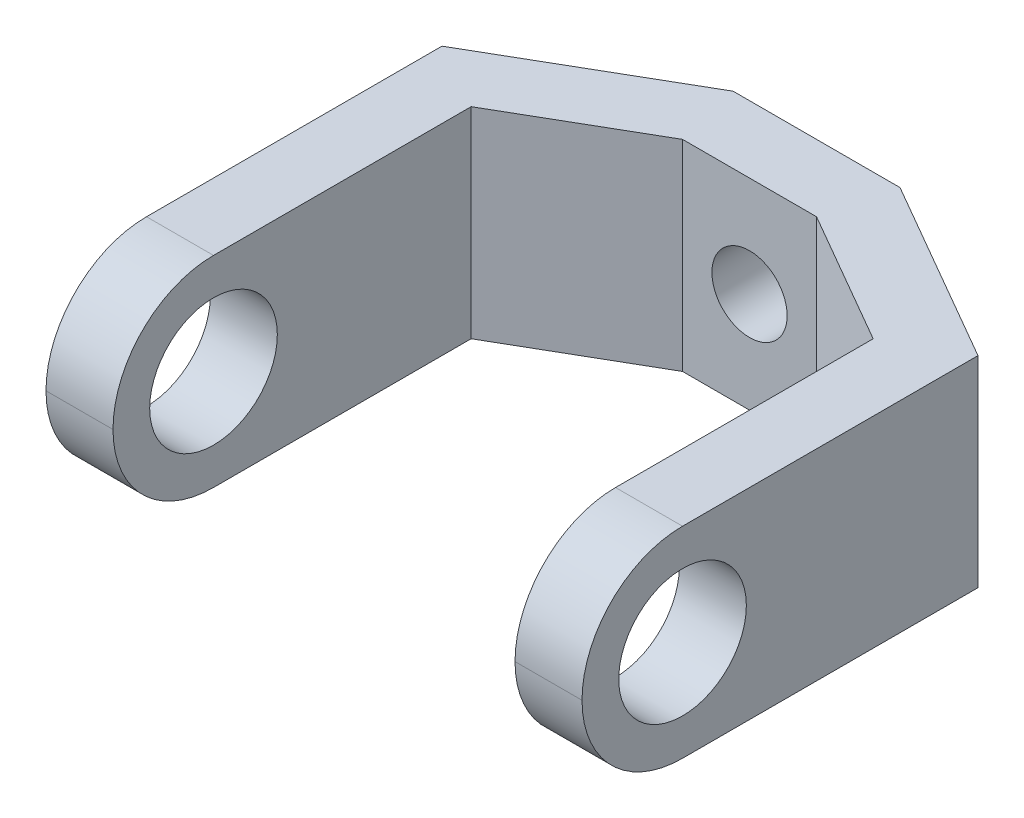
ISO-10303-21;
HEADER;
FILE_DESCRIPTION(('STEP AP214'),'2;1');
FILE_NAME('part.step','',(''),(''),'','','');
FILE_SCHEMA(('AUTOMOTIVE_DESIGN { 1 0 10303 214 1 1 1 1 }'));
ENDSEC;
DATA;
#1=APPLICATION_CONTEXT('core data for automotive mechanical design processes');
#2=APPLICATION_PROTOCOL_DEFINITION('international standard','automotive_design',2000,#1);
#3=PRODUCT_CONTEXT('',#1,'mechanical');
#4=PRODUCT('Part','Part','',(#3));
#5=PRODUCT_RELATED_PRODUCT_CATEGORY('part','',(#4));
#6=PRODUCT_DEFINITION_FORMATION('','',#4);
#7=PRODUCT_DEFINITION_CONTEXT('part definition',#1,'design');
#8=PRODUCT_DEFINITION('design','',#6,#7);
#9=PRODUCT_DEFINITION_SHAPE('','',#8);
#10=(LENGTH_UNIT() NAMED_UNIT(*) SI_UNIT(.MILLI.,.METRE.));
#11=(NAMED_UNIT(*) PLANE_ANGLE_UNIT() SI_UNIT($,.RADIAN.));
#12=(NAMED_UNIT(*) SI_UNIT($,.STERADIAN.) SOLID_ANGLE_UNIT());
#13=UNCERTAINTY_MEASURE_WITH_UNIT(LENGTH_MEASURE(1.E-05),#10,'distance_accuracy_value','');
#14=(GEOMETRIC_REPRESENTATION_CONTEXT(3) GLOBAL_UNCERTAINTY_ASSIGNED_CONTEXT((#13)) GLOBAL_UNIT_ASSIGNED_CONTEXT((#10,
#11,#12)) REPRESENTATION_CONTEXT('',''));
#15=CARTESIAN_POINT('',(0.,0.,0.));
#16=DIRECTION('',(0.,0.,1.));
#17=DIRECTION('',(1.,0.,0.));
#18=AXIS2_PLACEMENT_3D('',#15,#16,#17);
#19=CARTESIAN_POINT('',(-15.,7.5,-19.2264973081037));
#20=DIRECTION('',(-1.,0.,0.));
#21=DIRECTION('',(0.,0.,1.));
#22=AXIS2_PLACEMENT_3D('',#19,#20,#21);
#23=PLANE('',#22);
#24=CARTESIAN_POINT('',(-15.,0.,0.));
#25=DIRECTION('',(-1.,0.,0.));
#26=DIRECTION('',(0.,0.,1.));
#27=AXIS2_PLACEMENT_3D('',#24,#25,#26);
#28=CIRCLE('',#27,4.7625);
#29=CARTESIAN_POINT('',(-15.,0.,4.7625));
#30=VERTEX_POINT('',#29);
#31=EDGE_CURVE('E237',#30,#30,#28,.T.);
#32=ORIENTED_EDGE('',*,*,#31,.T.);
#33=EDGE_LOOP('',(#32));
#34=FACE_BOUND('',#33,.T.);
#35=CARTESIAN_POINT('',(-15.,0.,0.));
#36=DIRECTION('',(-1.,0.,0.));
#37=DIRECTION('',(0.,0.,1.));
#38=AXIS2_PLACEMENT_3D('',#35,#36,#37);
#39=CIRCLE('',#38,7.5);
#40=CARTESIAN_POINT('',(-15.,7.5,0.));
#41=VERTEX_POINT('',#40);
#42=CARTESIAN_POINT('',(-15.,0.,7.5));
#43=VERTEX_POINT('',#42);
#44=EDGE_CURVE('E63',#41,#43,#39,.F.);
#45=ORIENTED_EDGE('',*,*,#44,.T.);
#46=CARTESIAN_POINT('',(-15.,0.,0.));
#47=DIRECTION('',(-1.,0.,0.));
#48=DIRECTION('',(0.,0.,1.));
#49=AXIS2_PLACEMENT_3D('',#46,#47,#48);
#50=CIRCLE('',#49,7.5);
#51=CARTESIAN_POINT('',(-15.,-7.5,0.));
#52=VERTEX_POINT('',#51);
#53=EDGE_CURVE('E200',#43,#52,#50,.F.);
#54=ORIENTED_EDGE('',*,*,#53,.T.);
#55=DIRECTION('',(0.,0.,-1.));
#56=VECTOR('',#55,1.);
#57=CARTESIAN_POINT('',(-15.,-7.5,-19.2264973081037));
#58=LINE('',#57,#56);
#59=CARTESIAN_POINT('',(-15.,-7.5,-19.2264973081037));
#60=VERTEX_POINT('',#59);
#61=EDGE_CURVE('E164',#52,#60,#58,.T.);
#62=ORIENTED_EDGE('',*,*,#61,.T.);
#63=DIRECTION('',(0.,-1.,0.));
#64=VECTOR('',#63,1.);
#65=CARTESIAN_POINT('',(-15.,7.5,-19.2264973081037));
#66=LINE('',#65,#64);
#67=CARTESIAN_POINT('',(-15.,7.5,-19.2264973081037));
#68=VERTEX_POINT('',#67);
#69=EDGE_CURVE('E156',#68,#60,#66,.T.);
#70=ORIENTED_EDGE('',*,*,#69,.F.);
#71=DIRECTION('',(0.,0.,-1.));
#72=VECTOR('',#71,1.);
#73=CARTESIAN_POINT('',(-15.,7.5,-19.2264973081037));
#74=LINE('',#73,#72);
#75=EDGE_CURVE('E140',#41,#68,#74,.T.);
#76=ORIENTED_EDGE('',*,*,#75,.F.);
#77=EDGE_LOOP('',(#45,#54,#62,#70,#76));
#78=FACE_BOUND('',#77,.T.);
#79=ADVANCED_FACE('F39',(#34,#78),#23,.F.);
#80=CARTESIAN_POINT('',(-4.99999999999997,7.5,-25.));
#81=DIRECTION('',(-0.500000000000001,0.,-0.866025403784438));
#82=DIRECTION('',(-0.866025403784438,0.,0.500000000000001));
#83=AXIS2_PLACEMENT_3D('',#80,#81,#82);
#84=PLANE('',#83);
#85=DIRECTION('',(0.866025403784438,0.,-0.500000000000001));
#86=VECTOR('',#85,1.);
#87=CARTESIAN_POINT('',(-4.99999999999997,-7.5,-25.));
#88=LINE('',#87,#86);
#89=CARTESIAN_POINT('',(-4.99999999999997,-7.5,-25.));
#90=VERTEX_POINT('',#89);
#91=EDGE_CURVE('E267',#60,#90,#88,.T.);
#92=ORIENTED_EDGE('',*,*,#91,.T.);
#93=DIRECTION('',(0.,-1.,0.));
#94=VECTOR('',#93,1.);
#95=CARTESIAN_POINT('',(-4.99999999999997,7.5,-25.));
#96=LINE('',#95,#94);
#97=CARTESIAN_POINT('',(-4.99999999999997,7.5,-25.));
#98=VERTEX_POINT('',#97);
#99=EDGE_CURVE('E158',#98,#90,#96,.T.);
#100=ORIENTED_EDGE('',*,*,#99,.F.);
#101=DIRECTION('',(0.866025403784438,0.,-0.500000000000001));
#102=VECTOR('',#101,1.);
#103=CARTESIAN_POINT('',(-4.99999999999997,7.5,-25.));
#104=LINE('',#103,#102);
#105=EDGE_CURVE('E144',#68,#98,#104,.T.);
#106=ORIENTED_EDGE('',*,*,#105,.F.);
#107=ORIENTED_EDGE('',*,*,#69,.T.);
#108=EDGE_LOOP('',(#92,#100,#106,#107));
#109=FACE_BOUND('',#108,.T.);
#110=ADVANCED_FACE('F155',(#109),#84,.F.);
#111=CARTESIAN_POINT('',(5.00000000000003,7.5,-25.));
#112=DIRECTION('',(0.,0.,-1.));
#113=DIRECTION('',(-1.,0.,0.));
#114=AXIS2_PLACEMENT_3D('',#111,#112,#113);
#115=PLANE('',#114);
#116=CARTESIAN_POINT('',(0.,0.,-25.));
#117=DIRECTION('',(0.,0.,-1.));
#118=DIRECTION('',(-1.,0.,0.));
#119=AXIS2_PLACEMENT_3D('',#116,#117,#118);
#120=CIRCLE('',#119,2.8067);
#121=CARTESIAN_POINT('',(-2.8067,0.,-25.));
#122=VERTEX_POINT('',#121);
#123=EDGE_CURVE('E217',#122,#122,#120,.T.);
#124=ORIENTED_EDGE('',*,*,#123,.T.);
#125=EDGE_LOOP('',(#124));
#126=FACE_BOUND('',#125,.T.);
#127=DIRECTION('',(1.,0.,0.));
#128=VECTOR('',#127,1.);
#129=CARTESIAN_POINT('',(5.00000000000003,-7.5,-25.));
#130=LINE('',#129,#128);
#131=CARTESIAN_POINT('',(5.00000000000003,-7.5,-25.));
#132=VERTEX_POINT('',#131);
#133=EDGE_CURVE('E270',#90,#132,#130,.T.);
#134=ORIENTED_EDGE('',*,*,#133,.T.);
#135=DIRECTION('',(0.,-1.,0.));
#136=VECTOR('',#135,1.);
#137=CARTESIAN_POINT('',(5.00000000000003,7.5,-25.));
#138=LINE('',#137,#136);
#139=CARTESIAN_POINT('',(5.00000000000003,7.5,-25.));
#140=VERTEX_POINT('',#139);
#141=EDGE_CURVE('E172',#140,#132,#138,.T.);
#142=ORIENTED_EDGE('',*,*,#141,.F.);
#143=DIRECTION('',(1.,0.,0.));
#144=VECTOR('',#143,1.);
#145=CARTESIAN_POINT('',(5.00000000000003,7.5,-25.));
#146=LINE('',#145,#144);
#147=EDGE_CURVE('E161',#98,#140,#146,.T.);
#148=ORIENTED_EDGE('',*,*,#147,.F.);
#149=ORIENTED_EDGE('',*,*,#99,.T.);
#150=EDGE_LOOP('',(#134,#142,#148,#149));
#151=FACE_BOUND('',#150,.T.);
#152=ADVANCED_FACE('F337',(#126,#151),#115,.F.);
#153=CARTESIAN_POINT('',(15.,7.5,-19.2264973081037));
#154=DIRECTION('',(0.5,0.,-0.866025403784438));
#155=DIRECTION('',(-0.866025403784439,0.,-0.5));
#156=AXIS2_PLACEMENT_3D('',#153,#154,#155);
#157=PLANE('',#156);
#158=DIRECTION('',(0.866025403784438,0.,0.5));
#159=VECTOR('',#158,1.);
#160=CARTESIAN_POINT('',(15.,-7.5,-19.2264973081037));
#161=LINE('',#160,#159);
#162=CARTESIAN_POINT('',(15.,-7.5,-19.2264973081037));
#163=VERTEX_POINT('',#162);
#164=EDGE_CURVE('E273',#132,#163,#161,.T.);
#165=ORIENTED_EDGE('',*,*,#164,.T.);
#166=DIRECTION('',(0.,-1.,0.));
#167=VECTOR('',#166,1.);
#168=CARTESIAN_POINT('',(15.,7.5,-19.2264973081037));
#169=LINE('',#168,#167);
#170=CARTESIAN_POINT('',(15.,7.5,-19.2264973081037));
#171=VERTEX_POINT('',#170);
#172=EDGE_CURVE('E309',#171,#163,#169,.T.);
#173=ORIENTED_EDGE('',*,*,#172,.F.);
#174=DIRECTION('',(0.866025403784438,0.,0.5));
#175=VECTOR('',#174,1.);
#176=CARTESIAN_POINT('',(15.,7.5,-19.2264973081037));
#177=LINE('',#176,#175);
#178=EDGE_CURVE('E243',#140,#171,#177,.T.);
#179=ORIENTED_EDGE('',*,*,#178,.F.);
#180=ORIENTED_EDGE('',*,*,#141,.T.);
#181=EDGE_LOOP('',(#165,#173,#179,#180));
#182=FACE_BOUND('',#181,.T.);
#183=ADVANCED_FACE('F318',(#182),#157,.F.);
#184=CARTESIAN_POINT('',(15.,7.5,7.50000000000001));
#185=DIRECTION('',(1.,0.,0.));
#186=DIRECTION('',(0.,0.,-1.));
#187=AXIS2_PLACEMENT_3D('',#184,#185,#186);
#188=PLANE('',#187);
#189=CARTESIAN_POINT('',(15.,0.,0.));
#190=DIRECTION('',(1.,0.,0.));
#191=DIRECTION('',(0.,0.,-1.));
#192=AXIS2_PLACEMENT_3D('',#189,#190,#191);
#193=CIRCLE('',#192,4.7625);
#194=CARTESIAN_POINT('',(15.,0.,-4.7625));
#195=VERTEX_POINT('',#194);
#196=EDGE_CURVE('E233',#195,#195,#193,.T.);
#197=ORIENTED_EDGE('',*,*,#196,.T.);
#198=EDGE_LOOP('',(#197));
#199=FACE_BOUND('',#198,.T.);
#200=CARTESIAN_POINT('',(15.,0.,0.));
#201=DIRECTION('',(1.,0.,0.));
#202=DIRECTION('',(0.,0.,-1.));
#203=AXIS2_PLACEMENT_3D('',#200,#201,#202);
#204=CIRCLE('',#203,7.5);
#205=CARTESIAN_POINT('',(15.,-7.5,0.));
#206=VERTEX_POINT('',#205);
#207=CARTESIAN_POINT('',(15.,0.,7.50000000000001));
#208=VERTEX_POINT('',#207);
#209=EDGE_CURVE('E185',#206,#208,#204,.F.);
#210=ORIENTED_EDGE('',*,*,#209,.T.);
#211=CARTESIAN_POINT('',(15.,0.,0.));
#212=DIRECTION('',(1.,0.,0.));
#213=DIRECTION('',(0.,0.,-1.));
#214=AXIS2_PLACEMENT_3D('',#211,#212,#213);
#215=CIRCLE('',#214,7.5);
#216=CARTESIAN_POINT('',(15.,7.5,0.));
#217=VERTEX_POINT('',#216);
#218=EDGE_CURVE('E188',#208,#217,#215,.F.);
#219=ORIENTED_EDGE('',*,*,#218,.T.);
#220=DIRECTION('',(0.,0.,1.));
#221=VECTOR('',#220,1.);
#222=CARTESIAN_POINT('',(15.,7.5,7.50000000000001));
#223=LINE('',#222,#221);
#224=EDGE_CURVE('E246',#171,#217,#223,.T.);
#225=ORIENTED_EDGE('',*,*,#224,.F.);
#226=ORIENTED_EDGE('',*,*,#172,.T.);
#227=DIRECTION('',(0.,0.,1.));
#228=VECTOR('',#227,1.);
#229=CARTESIAN_POINT('',(15.,-7.5,7.50000000000001));
#230=LINE('',#229,#228);
#231=EDGE_CURVE('E276',#163,#206,#230,.T.);
#232=ORIENTED_EDGE('',*,*,#231,.T.);
#233=EDGE_LOOP('',(#210,#219,#225,#226,#232));
#234=FACE_BOUND('',#233,.T.);
#235=ADVANCED_FACE('F329',(#199,#234),#188,.F.);
#236=CARTESIAN_POINT('',(20.,7.5,-22.049394584692));
#237=DIRECTION('',(-1.,0.,0.));
#238=DIRECTION('',(0.,0.,1.));
#239=AXIS2_PLACEMENT_3D('',#236,#237,#238);
#240=PLANE('',#239);
#241=CARTESIAN_POINT('',(20.,0.,0.));
#242=DIRECTION('',(1.,0.,0.));
#243=DIRECTION('',(0.,0.,-1.));
#244=AXIS2_PLACEMENT_3D('',#241,#242,#243);
#245=CIRCLE('',#244,4.7625);
#246=CARTESIAN_POINT('',(20.,0.,-4.7625));
#247=VERTEX_POINT('',#246);
#248=EDGE_CURVE('E207',#247,#247,#245,.T.);
#249=ORIENTED_EDGE('',*,*,#248,.F.);
#250=EDGE_LOOP('',(#249));
#251=FACE_BOUND('',#250,.T.);
#252=DIRECTION('',(0.,0.,-1.));
#253=VECTOR('',#252,1.);
#254=CARTESIAN_POINT('',(20.,7.5,-22.049394584692));
#255=LINE('',#254,#253);
#256=CARTESIAN_POINT('',(20.,7.5,0.));
#257=VERTEX_POINT('',#256);
#258=CARTESIAN_POINT('',(20.,7.5,-22.049394584692));
#259=VERTEX_POINT('',#258);
#260=EDGE_CURVE('E249',#257,#259,#255,.T.);
#261=ORIENTED_EDGE('',*,*,#260,.F.);
#262=CARTESIAN_POINT('',(20.,0.,0.));
#263=DIRECTION('',(-1.,0.,0.));
#264=DIRECTION('',(0.,0.,1.));
#265=AXIS2_PLACEMENT_3D('',#262,#263,#264);
#266=CIRCLE('',#265,7.5);
#267=CARTESIAN_POINT('',(20.,0.,7.50000000000001));
#268=VERTEX_POINT('',#267);
#269=EDGE_CURVE('E182',#257,#268,#266,.F.);
#270=ORIENTED_EDGE('',*,*,#269,.T.);
#271=CARTESIAN_POINT('',(20.,0.,0.));
#272=DIRECTION('',(-1.,0.,0.));
#273=DIRECTION('',(0.,0.,1.));
#274=AXIS2_PLACEMENT_3D('',#271,#272,#273);
#275=CIRCLE('',#274,7.5);
#276=CARTESIAN_POINT('',(20.,-7.5,0.));
#277=VERTEX_POINT('',#276);
#278=EDGE_CURVE('E179',#268,#277,#275,.F.);
#279=ORIENTED_EDGE('',*,*,#278,.T.);
#280=DIRECTION('',(0.,0.,-1.));
#281=VECTOR('',#280,1.);
#282=CARTESIAN_POINT('',(20.,-7.5,-22.049394584692));
#283=LINE('',#282,#281);
#284=CARTESIAN_POINT('',(20.,-7.5,-22.049394584692));
#285=VERTEX_POINT('',#284);
#286=EDGE_CURVE('E280',#277,#285,#283,.T.);
#287=ORIENTED_EDGE('',*,*,#286,.T.);
#288=DIRECTION('',(0.,-1.,0.));
#289=VECTOR('',#288,1.);
#290=CARTESIAN_POINT('',(20.,7.5,-22.049394584692));
#291=LINE('',#290,#289);
#292=EDGE_CURVE('E305',#259,#285,#291,.T.);
#293=ORIENTED_EDGE('',*,*,#292,.F.);
#294=EDGE_LOOP('',(#261,#270,#279,#287,#293));
#295=FACE_BOUND('',#294,.T.);
#296=ADVANCED_FACE('F387',(#251,#295),#240,.F.);
#297=CARTESIAN_POINT('',(6.2291474697544,7.5,-30.));
#298=DIRECTION('',(-0.500000000000001,0.,0.866025403784438));
#299=DIRECTION('',(0.866025403784438,0.,0.500000000000001));
#300=AXIS2_PLACEMENT_3D('',#297,#298,#299);
#301=PLANE('',#300);
#302=DIRECTION('',(-0.866025403784438,0.,-0.500000000000001));
#303=VECTOR('',#302,1.);
#304=CARTESIAN_POINT('',(6.2291474697544,-7.5,-30.));
#305=LINE('',#304,#303);
#306=CARTESIAN_POINT('',(6.2291474697544,-7.5,-30.));
#307=VERTEX_POINT('',#306);
#308=EDGE_CURVE('E283',#285,#307,#305,.T.);
#309=ORIENTED_EDGE('',*,*,#308,.T.);
#310=DIRECTION('',(0.,-1.,0.));
#311=VECTOR('',#310,1.);
#312=CARTESIAN_POINT('',(6.2291474697544,7.5,-30.));
#313=LINE('',#312,#311);
#314=CARTESIAN_POINT('',(6.2291474697544,7.5,-30.));
#315=VERTEX_POINT('',#314);
#316=EDGE_CURVE('E301',#315,#307,#313,.T.);
#317=ORIENTED_EDGE('',*,*,#316,.F.);
#318=DIRECTION('',(-0.866025403784438,0.,-0.500000000000001));
#319=VECTOR('',#318,1.);
#320=CARTESIAN_POINT('',(6.2291474697544,7.5,-30.));
#321=LINE('',#320,#319);
#322=EDGE_CURVE('E252',#259,#315,#321,.T.);
#323=ORIENTED_EDGE('',*,*,#322,.F.);
#324=ORIENTED_EDGE('',*,*,#292,.T.);
#325=EDGE_LOOP('',(#309,#317,#323,#324));
#326=FACE_BOUND('',#325,.T.);
#327=ADVANCED_FACE('F384',(#326),#301,.F.);
#328=CARTESIAN_POINT('',(-6.22914746975434,7.5,-30.));
#329=DIRECTION('',(0.,0.,1.));
#330=DIRECTION('',(1.,0.,0.));
#331=AXIS2_PLACEMENT_3D('',#328,#329,#330);
#332=PLANE('',#331);
#333=CARTESIAN_POINT('',(0.,0.,-30.));
#334=DIRECTION('',(0.,0.,1.));
#335=DIRECTION('',(1.,0.,0.));
#336=AXIS2_PLACEMENT_3D('',#333,#334,#335);
#337=CIRCLE('',#336,2.8067);
#338=CARTESIAN_POINT('',(2.8067,0.,-30.));
#339=VERTEX_POINT('',#338);
#340=EDGE_CURVE('E222',#339,#339,#337,.T.);
#341=ORIENTED_EDGE('',*,*,#340,.T.);
#342=EDGE_LOOP('',(#341));
#343=FACE_BOUND('',#342,.T.);
#344=DIRECTION('',(-1.,0.,0.));
#345=VECTOR('',#344,1.);
#346=CARTESIAN_POINT('',(-6.22914746975434,-7.5,-30.));
#347=LINE('',#346,#345);
#348=CARTESIAN_POINT('',(-6.22914746975434,-7.5,-30.));
#349=VERTEX_POINT('',#348);
#350=EDGE_CURVE('E286',#307,#349,#347,.T.);
#351=ORIENTED_EDGE('',*,*,#350,.T.);
#352=DIRECTION('',(0.,-1.,0.));
#353=VECTOR('',#352,1.);
#354=CARTESIAN_POINT('',(-6.22914746975434,7.5,-30.));
#355=LINE('',#354,#353);
#356=CARTESIAN_POINT('',(-6.22914746975434,7.5,-30.));
#357=VERTEX_POINT('',#356);
#358=EDGE_CURVE('E297',#357,#349,#355,.T.);
#359=ORIENTED_EDGE('',*,*,#358,.F.);
#360=DIRECTION('',(-1.,0.,0.));
#361=VECTOR('',#360,1.);
#362=CARTESIAN_POINT('',(-6.22914746975434,7.5,-30.));
#363=LINE('',#362,#361);
#364=EDGE_CURVE('E255',#315,#357,#363,.T.);
#365=ORIENTED_EDGE('',*,*,#364,.F.);
#366=ORIENTED_EDGE('',*,*,#316,.T.);
#367=EDGE_LOOP('',(#351,#359,#365,#366));
#368=FACE_BOUND('',#367,.T.);
#369=ADVANCED_FACE('F379',(#343,#368),#332,.F.);
#370=CARTESIAN_POINT('',(-20.,7.5,-22.049394584692));
#371=DIRECTION('',(0.500000000000001,0.,0.866025403784438));
#372=DIRECTION('',(0.866025403784438,0.,-0.500000000000001));
#373=AXIS2_PLACEMENT_3D('',#370,#371,#372);
#374=PLANE('',#373);
#375=DIRECTION('',(-0.866025403784438,0.,0.500000000000001));
#376=VECTOR('',#375,1.);
#377=CARTESIAN_POINT('',(-20.,-7.5,-22.049394584692));
#378=LINE('',#377,#376);
#379=CARTESIAN_POINT('',(-20.,-7.5,-22.049394584692));
#380=VERTEX_POINT('',#379);
#381=EDGE_CURVE('E289',#349,#380,#378,.T.);
#382=ORIENTED_EDGE('',*,*,#381,.T.);
#383=DIRECTION('',(0.,-1.,0.));
#384=VECTOR('',#383,1.);
#385=CARTESIAN_POINT('',(-20.,7.5,-22.049394584692));
#386=LINE('',#385,#384);
#387=CARTESIAN_POINT('',(-20.,7.5,-22.049394584692));
#388=VERTEX_POINT('',#387);
#389=EDGE_CURVE('E264',#388,#380,#386,.T.);
#390=ORIENTED_EDGE('',*,*,#389,.F.);
#391=DIRECTION('',(-0.866025403784438,0.,0.500000000000001));
#392=VECTOR('',#391,1.);
#393=CARTESIAN_POINT('',(-20.,7.5,-22.049394584692));
#394=LINE('',#393,#392);
#395=EDGE_CURVE('E258',#357,#388,#394,.T.);
#396=ORIENTED_EDGE('',*,*,#395,.F.);
#397=ORIENTED_EDGE('',*,*,#358,.T.);
#398=EDGE_LOOP('',(#382,#390,#396,#397));
#399=FACE_BOUND('',#398,.T.);
#400=ADVANCED_FACE('F374',(#399),#374,.F.);
#401=CARTESIAN_POINT('',(-20.,7.5,7.5));
#402=DIRECTION('',(1.,0.,0.));
#403=DIRECTION('',(0.,0.,-1.));
#404=AXIS2_PLACEMENT_3D('',#401,#402,#403);
#405=PLANE('',#404);
#406=CARTESIAN_POINT('',(-20.,0.,0.));
#407=DIRECTION('',(1.,0.,0.));
#408=DIRECTION('',(0.,0.,-1.));
#409=AXIS2_PLACEMENT_3D('',#406,#407,#408);
#410=CIRCLE('',#409,4.7625);
#411=CARTESIAN_POINT('',(-20.,0.,-4.7625));
#412=VERTEX_POINT('',#411);
#413=EDGE_CURVE('E214',#412,#412,#410,.T.);
#414=ORIENTED_EDGE('',*,*,#413,.T.);
#415=EDGE_LOOP('',(#414));
#416=FACE_BOUND('',#415,.T.);
#417=DIRECTION('',(0.,0.,1.));
#418=VECTOR('',#417,1.);
#419=CARTESIAN_POINT('',(-20.,-7.5,7.5));
#420=LINE('',#419,#418);
#421=CARTESIAN_POINT('',(-20.,-7.5,0.));
#422=VERTEX_POINT('',#421);
#423=EDGE_CURVE('E151',#380,#422,#420,.T.);
#424=ORIENTED_EDGE('',*,*,#423,.T.);
#425=CARTESIAN_POINT('',(-20.,0.,0.));
#426=DIRECTION('',(1.,0.,0.));
#427=DIRECTION('',(0.,0.,-1.));
#428=AXIS2_PLACEMENT_3D('',#425,#426,#427);
#429=CIRCLE('',#428,7.5);
#430=CARTESIAN_POINT('',(-20.,0.,7.5));
#431=VERTEX_POINT('',#430);
#432=EDGE_CURVE('E11',#422,#431,#429,.F.);
#433=ORIENTED_EDGE('',*,*,#432,.T.);
#434=CARTESIAN_POINT('',(-20.,0.,0.));
#435=DIRECTION('',(1.,0.,0.));
#436=DIRECTION('',(0.,0.,-1.));
#437=AXIS2_PLACEMENT_3D('',#434,#435,#436);
#438=CIRCLE('',#437,7.5);
#439=CARTESIAN_POINT('',(-20.,7.5,0.));
#440=VERTEX_POINT('',#439);
#441=EDGE_CURVE('E49',#431,#440,#438,.F.);
#442=ORIENTED_EDGE('',*,*,#441,.T.);
#443=DIRECTION('',(0.,0.,1.));
#444=VECTOR('',#443,1.);
#445=CARTESIAN_POINT('',(-20.,7.5,7.5));
#446=LINE('',#445,#444);
#447=EDGE_CURVE('E261',#388,#440,#446,.T.);
#448=ORIENTED_EDGE('',*,*,#447,.F.);
#449=ORIENTED_EDGE('',*,*,#389,.T.);
#450=EDGE_LOOP('',(#424,#433,#442,#448,#449));
#451=FACE_BOUND('',#450,.T.);
#452=ADVANCED_FACE('F369',(#416,#451),#405,.F.);
#453=CARTESIAN_POINT('',(0.,7.5,0.));
#454=DIRECTION('',(0.,-1.,0.));
#455=DIRECTION('',(0.,0.,-1.));
#456=AXIS2_PLACEMENT_3D('',#453,#454,#455);
#457=PLANE('',#456);
#458=ORIENTED_EDGE('',*,*,#224,.T.);
#459=DIRECTION('',(1.,0.,0.));
#460=VECTOR('',#459,1.);
#461=CARTESIAN_POINT('',(0.,7.5,0.));
#462=LINE('',#461,#460);
#463=EDGE_CURVE('E170',#217,#257,#462,.T.);
#464=ORIENTED_EDGE('',*,*,#463,.T.);
#465=ORIENTED_EDGE('',*,*,#260,.T.);
#466=ORIENTED_EDGE('',*,*,#322,.T.);
#467=ORIENTED_EDGE('',*,*,#364,.T.);
#468=ORIENTED_EDGE('',*,*,#395,.T.);
#469=ORIENTED_EDGE('',*,*,#447,.T.);
#470=DIRECTION('',(1.,0.,0.));
#471=VECTOR('',#470,1.);
#472=CARTESIAN_POINT('',(0.,7.5,0.));
#473=LINE('',#472,#471);
#474=EDGE_CURVE('E148',#440,#41,#473,.T.);
#475=ORIENTED_EDGE('',*,*,#474,.T.);
#476=ORIENTED_EDGE('',*,*,#75,.T.);
#477=ORIENTED_EDGE('',*,*,#105,.T.);
#478=ORIENTED_EDGE('',*,*,#147,.T.);
#479=ORIENTED_EDGE('',*,*,#178,.T.);
#480=EDGE_LOOP('',(#458,#464,#465,#466,#467,#468,#469,#475,#476,#477,#478,#479));
#481=FACE_BOUND('',#480,.T.);
#482=ADVANCED_FACE('F143',(#481),#457,.F.);
#483=CARTESIAN_POINT('',(0.,-7.5,0.));
#484=DIRECTION('',(0.,-1.,0.));
#485=DIRECTION('',(0.,0.,-1.));
#486=AXIS2_PLACEMENT_3D('',#483,#484,#485);
#487=PLANE('',#486);
#488=ORIENTED_EDGE('',*,*,#286,.F.);
#489=DIRECTION('',(1.,0.,0.));
#490=VECTOR('',#489,1.);
#491=CARTESIAN_POINT('',(15.,-7.5,0.));
#492=LINE('',#491,#490);
#493=EDGE_CURVE('E195',#277,#206,#492,.F.);
#494=ORIENTED_EDGE('',*,*,#493,.T.);
#495=ORIENTED_EDGE('',*,*,#231,.F.);
#496=ORIENTED_EDGE('',*,*,#164,.F.);
#497=ORIENTED_EDGE('',*,*,#133,.F.);
#498=ORIENTED_EDGE('',*,*,#91,.F.);
#499=ORIENTED_EDGE('',*,*,#61,.F.);
#500=DIRECTION('',(1.,0.,0.));
#501=VECTOR('',#500,1.);
#502=CARTESIAN_POINT('',(-20.,-7.5,0.));
#503=LINE('',#502,#501);
#504=EDGE_CURVE('E191',#52,#422,#503,.F.);
#505=ORIENTED_EDGE('',*,*,#504,.T.);
#506=ORIENTED_EDGE('',*,*,#423,.F.);
#507=ORIENTED_EDGE('',*,*,#381,.F.);
#508=ORIENTED_EDGE('',*,*,#350,.F.);
#509=ORIENTED_EDGE('',*,*,#308,.F.);
#510=EDGE_LOOP('',(#488,#494,#495,#496,#497,#498,#499,#505,#506,#507,#508,#509));
#511=FACE_BOUND('',#510,.T.);
#512=ADVANCED_FACE('F325',(#511),#487,.T.);
#513=CARTESIAN_POINT('',(-20.,0.,0.));
#514=DIRECTION('',(1.,0.,0.));
#515=DIRECTION('',(0.,0.,-1.));
#516=AXIS2_PLACEMENT_3D('',#513,#514,#515);
#517=CYLINDRICAL_SURFACE('',#516,4.7625);
#518=ORIENTED_EDGE('',*,*,#413,.F.);
#519=EDGE_LOOP('',(#518));
#520=FACE_BOUND('',#519,.T.);
#521=ORIENTED_EDGE('',*,*,#31,.F.);
#522=EDGE_LOOP('',(#521));
#523=FACE_BOUND('',#522,.T.);
#524=ADVANCED_FACE('F410',(#520,#523),#517,.F.);
#525=ORIENTED_EDGE('',*,*,#248,.T.);
#526=EDGE_LOOP('',(#525));
#527=FACE_BOUND('',#526,.T.);
#528=ORIENTED_EDGE('',*,*,#196,.F.);
#529=EDGE_LOOP('',(#528));
#530=FACE_BOUND('',#529,.T.);
#531=ADVANCED_FACE('F355',(#527,#530),#517,.F.);
#532=CARTESIAN_POINT('',(20.,0.,0.));
#533=DIRECTION('',(-1.,0.,0.));
#534=DIRECTION('',(0.,0.,1.));
#535=AXIS2_PLACEMENT_3D('',#532,#533,#534);
#536=CYLINDRICAL_SURFACE('',#535,7.5);
#537=DIRECTION('',(1.,0.,0.));
#538=VECTOR('',#537,1.);
#539=CARTESIAN_POINT('',(20.,0.,7.50000000000001));
#540=LINE('',#539,#538);
#541=EDGE_CURVE('E204',#208,#268,#540,.T.);
#542=ORIENTED_EDGE('',*,*,#541,.F.);
#543=ORIENTED_EDGE('',*,*,#209,.F.);
#544=ORIENTED_EDGE('',*,*,#493,.F.);
#545=ORIENTED_EDGE('',*,*,#278,.F.);
#546=EDGE_LOOP('',(#542,#543,#544,#545));
#547=FACE_BOUND('',#546,.T.);
#548=ADVANCED_FACE('F332',(#547),#536,.T.);
#549=CARTESIAN_POINT('',(0.,0.,0.));
#550=DIRECTION('',(1.,0.,0.));
#551=DIRECTION('',(0.,0.,-1.));
#552=AXIS2_PLACEMENT_3D('',#549,#550,#551);
#553=CYLINDRICAL_SURFACE('',#552,7.5);
#554=ORIENTED_EDGE('',*,*,#218,.F.);
#555=ORIENTED_EDGE('',*,*,#541,.T.);
#556=ORIENTED_EDGE('',*,*,#269,.F.);
#557=ORIENTED_EDGE('',*,*,#463,.F.);
#558=EDGE_LOOP('',(#554,#555,#556,#557));
#559=FACE_BOUND('',#558,.T.);
#560=ADVANCED_FACE('F335',(#559),#553,.T.);
#561=CARTESIAN_POINT('',(0.,0.,0.));
#562=DIRECTION('',(1.,0.,0.));
#563=DIRECTION('',(0.,0.,-1.));
#564=AXIS2_PLACEMENT_3D('',#561,#562,#563);
#565=CYLINDRICAL_SURFACE('',#564,7.5);
#566=ORIENTED_EDGE('',*,*,#474,.F.);
#567=ORIENTED_EDGE('',*,*,#441,.F.);
#568=DIRECTION('',(1.,0.,0.));
#569=VECTOR('',#568,1.);
#570=CARTESIAN_POINT('',(-15.,0.,7.5));
#571=LINE('',#570,#569);
#572=EDGE_CURVE('E43',#43,#431,#571,.F.);
#573=ORIENTED_EDGE('',*,*,#572,.F.);
#574=ORIENTED_EDGE('',*,*,#44,.F.);
#575=EDGE_LOOP('',(#566,#567,#573,#574));
#576=FACE_BOUND('',#575,.T.);
#577=ADVANCED_FACE('F41',(#576),#565,.T.);
#578=CARTESIAN_POINT('',(-15.,0.,0.));
#579=DIRECTION('',(-1.,0.,0.));
#580=DIRECTION('',(0.,0.,1.));
#581=AXIS2_PLACEMENT_3D('',#578,#579,#580);
#582=CYLINDRICAL_SURFACE('',#581,7.5);
#583=ORIENTED_EDGE('',*,*,#432,.F.);
#584=ORIENTED_EDGE('',*,*,#504,.F.);
#585=ORIENTED_EDGE('',*,*,#53,.F.);
#586=ORIENTED_EDGE('',*,*,#572,.T.);
#587=EDGE_LOOP('',(#583,#584,#585,#586));
#588=FACE_BOUND('',#587,.T.);
#589=ADVANCED_FACE('F356',(#588),#582,.T.);
#590=CARTESIAN_POINT('',(0.,0.,-30.));
#591=DIRECTION('',(0.,0.,1.));
#592=DIRECTION('',(1.,0.,0.));
#593=AXIS2_PLACEMENT_3D('',#590,#591,#592);
#594=CYLINDRICAL_SURFACE('',#593,2.8067);
#595=ORIENTED_EDGE('',*,*,#340,.F.);
#596=EDGE_LOOP('',(#595));
#597=FACE_BOUND('',#596,.T.);
#598=ORIENTED_EDGE('',*,*,#123,.F.);
#599=EDGE_LOOP('',(#598));
#600=FACE_BOUND('',#599,.T.);
#601=ADVANCED_FACE('F358',(#597,#600),#594,.F.);
#602=CLOSED_SHELL('',(#79,#110,#152,#183,#235,#296,#327,#369,#400,#452,#482,#512,#524,#531,#548,
#560,#577,#589,#601));
#603=MANIFOLD_SOLID_BREP('B2',#602);
#604=ADVANCED_BREP_SHAPE_REPRESENTATION('',(#18,#603),#14);
#605=SHAPE_DEFINITION_REPRESENTATION(#9,#604);
ENDSEC;
END-ISO-10303-21;
